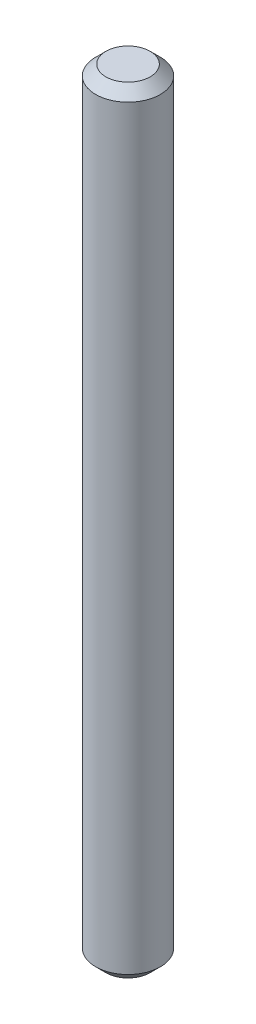
ISO-10303-21;
HEADER;
FILE_DESCRIPTION(('STEP AP214'),'2;1');
FILE_NAME('part.step','',(''),(''),'','','');
FILE_SCHEMA(('AUTOMOTIVE_DESIGN { 1 0 10303 214 1 1 1 1 }'));
ENDSEC;
DATA;
#1=APPLICATION_CONTEXT('core data for automotive mechanical design processes');
#2=APPLICATION_PROTOCOL_DEFINITION('international standard','automotive_design',2000,#1);
#3=PRODUCT_CONTEXT('',#1,'mechanical');
#4=PRODUCT('Part','Part','',(#3));
#5=PRODUCT_RELATED_PRODUCT_CATEGORY('part','',(#4));
#6=PRODUCT_DEFINITION_FORMATION('','',#4);
#7=PRODUCT_DEFINITION_CONTEXT('part definition',#1,'design');
#8=PRODUCT_DEFINITION('design','',#6,#7);
#9=PRODUCT_DEFINITION_SHAPE('','',#8);
#10=(LENGTH_UNIT() NAMED_UNIT(*) SI_UNIT(.MILLI.,.METRE.));
#11=(NAMED_UNIT(*) PLANE_ANGLE_UNIT() SI_UNIT($,.RADIAN.));
#12=(NAMED_UNIT(*) SI_UNIT($,.STERADIAN.) SOLID_ANGLE_UNIT());
#13=UNCERTAINTY_MEASURE_WITH_UNIT(LENGTH_MEASURE(1.E-05),#10,'distance_accuracy_value','');
#14=(GEOMETRIC_REPRESENTATION_CONTEXT(3) GLOBAL_UNCERTAINTY_ASSIGNED_CONTEXT((#13)) GLOBAL_UNIT_ASSIGNED_CONTEXT((#10,
#11,#12)) REPRESENTATION_CONTEXT('',''));
#15=CARTESIAN_POINT('',(0.,0.,0.));
#16=DIRECTION('',(0.,0.,1.));
#17=DIRECTION('',(1.,0.,0.));
#18=AXIS2_PLACEMENT_3D('',#15,#16,#17);
#19=CARTESIAN_POINT('',(0.,76.2,0.));
#20=DIRECTION('',(0.,-1.,0.));
#21=DIRECTION('',(0.,0.,-1.));
#22=AXIS2_PLACEMENT_3D('',#19,#20,#21);
#23=CYLINDRICAL_SURFACE('',#22,3.175);
#24=CARTESIAN_POINT('',(0.,75.2,0.));
#25=DIRECTION('',(0.,1.,0.));
#26=DIRECTION('',(0.,0.,1.));
#27=AXIS2_PLACEMENT_3D('',#24,#25,#26);
#28=CIRCLE('',#27,3.175);
#29=CARTESIAN_POINT('',(0.,75.2,-3.175));
#30=VERTEX_POINT('',#29);
#31=EDGE_CURVE('E40',#30,#30,#28,.F.);
#32=CARTESIAN_POINT('',(0.,1.00000000000004,0.));
#33=DIRECTION('',(0.,1.,0.));
#34=DIRECTION('',(0.,0.,1.));
#35=AXIS2_PLACEMENT_3D('',#32,#33,#34);
#36=CIRCLE('',#35,3.175);
#37=CARTESIAN_POINT('',(0.,1.00000000000003,-3.175));
#38=VERTEX_POINT('',#37);
#39=EDGE_CURVE('E44',#38,#38,#36,.T.);
#40=CARTESIAN_POINT('',(0.,75.2,-3.175));
#41=CARTESIAN_POINT('',(0.,74.4270833333333,-3.175));
#42=CARTESIAN_POINT('',(0.,73.6541666666667,-3.175));
#43=CARTESIAN_POINT('',(0.,72.1083333333333,-3.175));
#44=CARTESIAN_POINT('',(0.,71.3354166666667,-3.175));
#45=CARTESIAN_POINT('',(0.,69.7895833333334,-3.175));
#46=CARTESIAN_POINT('',(0.,69.0166666666667,-3.175));
#47=CARTESIAN_POINT('',(0.,67.4708333333334,-3.175));
#48=CARTESIAN_POINT('',(0.,66.6979166666667,-3.175));
#49=CARTESIAN_POINT('',(0.,65.1520833333334,-3.175));
#50=CARTESIAN_POINT('',(0.,64.3791666666667,-3.175));
#51=CARTESIAN_POINT('',(0.,62.8333333333333,-3.175));
#52=CARTESIAN_POINT('',(0.,62.0604166666667,-3.175));
#53=CARTESIAN_POINT('',(0.,60.5145833333333,-3.175));
#54=CARTESIAN_POINT('',(0.,59.7416666666667,-3.175));
#55=CARTESIAN_POINT('',(0.,58.1958333333333,-3.175));
#56=CARTESIAN_POINT('',(0.,57.4229166666667,-3.175));
#57=CARTESIAN_POINT('',(0.,55.8770833333333,-3.175));
#58=CARTESIAN_POINT('',(0.,55.1041666666667,-3.175));
#59=CARTESIAN_POINT('',(0.,53.5583333333333,-3.175));
#60=CARTESIAN_POINT('',(0.,52.7854166666667,-3.175));
#61=CARTESIAN_POINT('',(0.,51.2395833333333,-3.175));
#62=CARTESIAN_POINT('',(0.,50.4666666666667,-3.175));
#63=CARTESIAN_POINT('',(0.,48.9208333333333,-3.175));
#64=CARTESIAN_POINT('',(0.,48.1479166666667,-3.175));
#65=CARTESIAN_POINT('',(0.,46.6020833333333,-3.175));
#66=CARTESIAN_POINT('',(0.,45.8291666666667,-3.175));
#67=CARTESIAN_POINT('',(0.,44.2833333333334,-3.175));
#68=CARTESIAN_POINT('',(0.,43.5104166666667,-3.175));
#69=CARTESIAN_POINT('',(0.,41.9645833333334,-3.175));
#70=CARTESIAN_POINT('',(0.,41.1916666666667,-3.175));
#71=CARTESIAN_POINT('',(0.,39.6458333333334,-3.175));
#72=CARTESIAN_POINT('',(0.,38.8729166666667,-3.175));
#73=CARTESIAN_POINT('',(0.,37.3270833333334,-3.175));
#74=CARTESIAN_POINT('',(0.,36.5541666666667,-3.175));
#75=CARTESIAN_POINT('',(0.,35.0083333333334,-3.175));
#76=CARTESIAN_POINT('',(0.,34.2354166666667,-3.175));
#77=CARTESIAN_POINT('',(0.,32.6895833333334,-3.175));
#78=CARTESIAN_POINT('',(0.,31.9166666666667,-3.175));
#79=CARTESIAN_POINT('',(0.,30.3708333333334,-3.175));
#80=CARTESIAN_POINT('',(0.,29.5979166666667,-3.175));
#81=CARTESIAN_POINT('',(0.,28.0520833333334,-3.175));
#82=CARTESIAN_POINT('',(0.,27.2791666666667,-3.175));
#83=CARTESIAN_POINT('',(0.,25.7333333333334,-3.175));
#84=CARTESIAN_POINT('',(0.,24.9604166666667,-3.175));
#85=CARTESIAN_POINT('',(0.,23.4145833333334,-3.175));
#86=CARTESIAN_POINT('',(0.,22.6416666666667,-3.175));
#87=CARTESIAN_POINT('',(0.,21.0958333333334,-3.175));
#88=CARTESIAN_POINT('',(0.,20.3229166666667,-3.175));
#89=CARTESIAN_POINT('',(0.,18.7770833333334,-3.175));
#90=CARTESIAN_POINT('',(0.,18.0041666666667,-3.175));
#91=CARTESIAN_POINT('',(0.,16.4583333333334,-3.175));
#92=CARTESIAN_POINT('',(0.,15.6854166666667,-3.175));
#93=CARTESIAN_POINT('',(0.,14.1395833333334,-3.175));
#94=CARTESIAN_POINT('',(0.,13.3666666666667,-3.175));
#95=CARTESIAN_POINT('',(0.,11.8208333333334,-3.175));
#96=CARTESIAN_POINT('',(0.,11.0479166666667,-3.175));
#97=CARTESIAN_POINT('',(0.,9.50208333333336,-3.175));
#98=CARTESIAN_POINT('',(0.,8.7291666666667,-3.175));
#99=CARTESIAN_POINT('',(0.,7.18333333333336,-3.175));
#100=CARTESIAN_POINT('',(0.,6.4104166666667,-3.175));
#101=CARTESIAN_POINT('',(0.,4.86458333333336,-3.175));
#102=CARTESIAN_POINT('',(0.,4.09166666666669,-3.175));
#103=CARTESIAN_POINT('',(0.,2.54583333333336,-3.175));
#104=CARTESIAN_POINT('',(0.,1.77291666666669,-3.175));
#105=CARTESIAN_POINT('',(0.,1.00000000000003,-3.175));
#106=B_SPLINE_CURVE_WITH_KNOTS('',3,(#40,#41,#42,#43,#44,#45,#46,#47,#48,#49,#50,#51,#52,#53,
#54,#55,#56,#57,#58,#59,#60,#61,#62,#63,#64,#65,#66,#67,#68,#69,#70,#71,#72,#73,#74,#75,#76,#77,
#78,#79,#80,#81,#82,#83,#84,#85,#86,#87,#88,#89,#90,#91,#92,#93,#94,#95,#96,#97,#98,#99,#100,
#101,#102,#103,#104,#105),.UNSPECIFIED.,.F.,.F.,(4,2,2,2,2,2,2,2,2,2,2,2,2,2,2,2,2,2,2,2,2,2,2,
2,2,2,2,2,2,2,2,2,4),(0.,2.31874999999999,4.63749999999999,6.95624999999998,9.27499999999999,
11.59375,13.9125,16.23125,18.55,20.86875,23.1875,25.50625,27.825,30.14375,32.4625,34.78125,37.1,
39.41875,41.7375,44.05625,46.375,48.69375,51.0125,53.33125,55.65,57.96875,60.2875,62.60625,
64.925,67.24375,69.5625,71.88125,74.2),.UNSPECIFIED.);
#107=EDGE_CURVE('BSEAM32',#30,#38,#106,.T.);
#108=ORIENTED_EDGE('',*,*,#31,.T.);
#109=ORIENTED_EDGE('',*,*,#39,.T.);
#110=ORIENTED_EDGE('',*,*,#107,.T.);
#111=ORIENTED_EDGE('',*,*,#107,.F.);
#112=EDGE_LOOP('',(#108,#110,#109,#111));
#113=FACE_BOUND('',#112,.T.);
#114=ADVANCED_FACE('F32',(#113),#23,.T.);
#115=CARTESIAN_POINT('',(0.,76.2,0.));
#116=DIRECTION('',(0.,1.,0.));
#117=DIRECTION('',(0.,0.,1.));
#118=AXIS2_PLACEMENT_3D('',#115,#116,#117);
#119=PLANE('',#118);
#120=CARTESIAN_POINT('',(0.,76.2,0.));
#121=DIRECTION('',(0.,1.,0.));
#122=DIRECTION('',(0.,0.,1.));
#123=AXIS2_PLACEMENT_3D('',#120,#121,#122);
#124=CIRCLE('',#123,2.17500000000003);
#125=CARTESIAN_POINT('',(0.,76.2,2.17500000000003));
#126=VERTEX_POINT('',#125);
#127=EDGE_CURVE('E48',#126,#126,#124,.T.);
#128=ORIENTED_EDGE('',*,*,#127,.T.);
#129=EDGE_LOOP('',(#128));
#130=FACE_BOUND('',#129,.T.);
#131=ADVANCED_FACE('F54',(#130),#119,.T.);
#132=CARTESIAN_POINT('',(0.,0.,0.));
#133=DIRECTION('',(0.,1.,0.));
#134=DIRECTION('',(0.,0.,1.));
#135=AXIS2_PLACEMENT_3D('',#132,#133,#134);
#136=PLANE('',#135);
#137=CARTESIAN_POINT('',(0.,0.,0.));
#138=DIRECTION('',(0.,1.,0.));
#139=DIRECTION('',(0.,0.,1.));
#140=AXIS2_PLACEMENT_3D('',#137,#138,#139);
#141=CIRCLE('',#140,2.17499999999995);
#142=CARTESIAN_POINT('',(0.,0.,2.17499999999995));
#143=VERTEX_POINT('',#142);
#144=EDGE_CURVE('E10',#143,#143,#141,.F.);
#145=ORIENTED_EDGE('',*,*,#144,.T.);
#146=EDGE_LOOP('',(#145));
#147=FACE_BOUND('',#146,.T.);
#148=ADVANCED_FACE('F58',(#147),#136,.F.);
#149=CARTESIAN_POINT('',(0.,76.2,0.));
#150=DIRECTION('',(0.,-1.,0.));
#151=DIRECTION('',(0.,0.,-1.));
#152=AXIS2_PLACEMENT_3D('',#149,#150,#151);
#153=CONICAL_SURFACE('',#152,2.17500000000003,0.785398163397439);
#154=ORIENTED_EDGE('',*,*,#31,.F.);
#155=EDGE_LOOP('',(#154));
#156=FACE_BOUND('',#155,.T.);
#157=ORIENTED_EDGE('',*,*,#127,.F.);
#158=EDGE_LOOP('',(#157));
#159=FACE_BOUND('',#158,.T.);
#160=ADVANCED_FACE('F56',(#156,#159),#153,.T.);
#161=CARTESIAN_POINT('',(0.,1.00000000000004,0.));
#162=DIRECTION('',(0.,1.,0.));
#163=DIRECTION('',(0.,0.,1.));
#164=AXIS2_PLACEMENT_3D('',#161,#162,#163);
#165=CONICAL_SURFACE('',#164,3.175,0.78539816339745);
#166=ORIENTED_EDGE('',*,*,#144,.F.);
#167=EDGE_LOOP('',(#166));
#168=FACE_BOUND('',#167,.T.);
#169=ORIENTED_EDGE('',*,*,#39,.F.);
#170=EDGE_LOOP('',(#169));
#171=FACE_BOUND('',#170,.T.);
#172=ADVANCED_FACE('F35',(#168,#171),#165,.T.);
#173=CLOSED_SHELL('',(#114,#131,#148,#160,#172));
#174=MANIFOLD_SOLID_BREP('B2',#173);
#175=ADVANCED_BREP_SHAPE_REPRESENTATION('',(#18,#174),#14);
#176=SHAPE_DEFINITION_REPRESENTATION(#9,#175);
ENDSEC;
END-ISO-10303-21;
